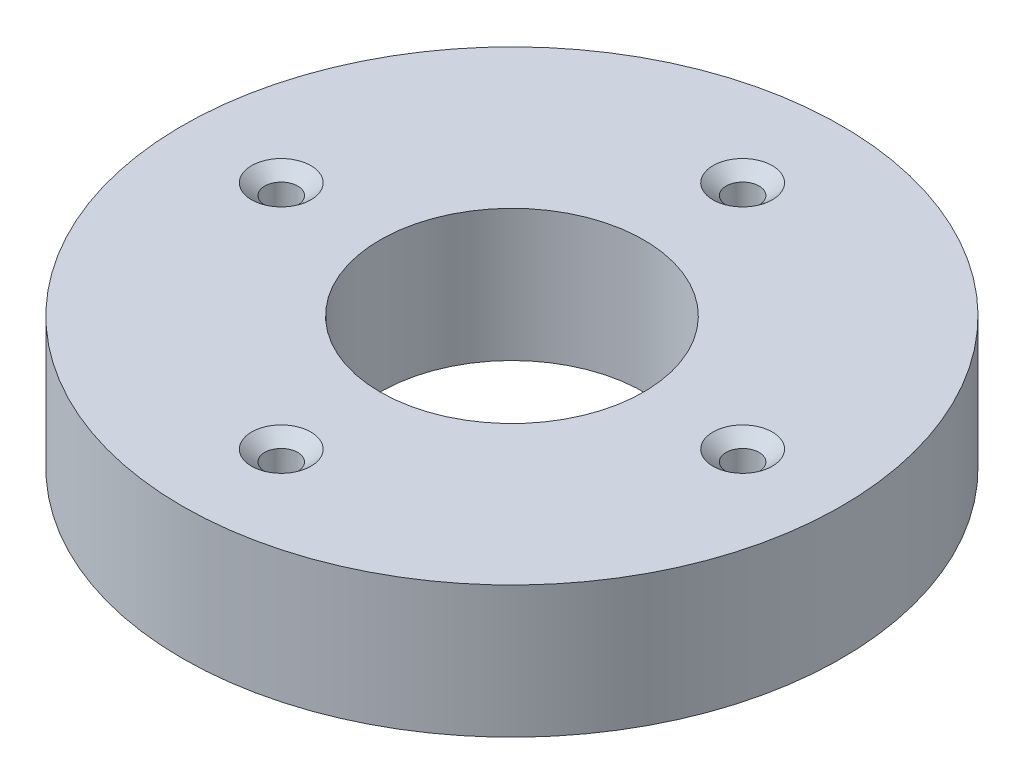
ISO-10303-21;
HEADER;
FILE_DESCRIPTION(('STEP AP214'),'2;1');
FILE_NAME('part.step','',(''),(''),'','','');
FILE_SCHEMA(('AUTOMOTIVE_DESIGN { 1 0 10303 214 1 1 1 1 }'));
ENDSEC;
DATA;
#1=APPLICATION_CONTEXT('core data for automotive mechanical design processes');
#2=APPLICATION_PROTOCOL_DEFINITION('international standard','automotive_design',2000,#1);
#3=PRODUCT_CONTEXT('',#1,'mechanical');
#4=PRODUCT('Part','Part','',(#3));
#5=PRODUCT_RELATED_PRODUCT_CATEGORY('part','',(#4));
#6=PRODUCT_DEFINITION_FORMATION('','',#4);
#7=PRODUCT_DEFINITION_CONTEXT('part definition',#1,'design');
#8=PRODUCT_DEFINITION('design','',#6,#7);
#9=PRODUCT_DEFINITION_SHAPE('','',#8);
#10=(LENGTH_UNIT() NAMED_UNIT(*) SI_UNIT(.MILLI.,.METRE.));
#11=(NAMED_UNIT(*) PLANE_ANGLE_UNIT() SI_UNIT($,.RADIAN.));
#12=(NAMED_UNIT(*) SI_UNIT($,.STERADIAN.) SOLID_ANGLE_UNIT());
#13=UNCERTAINTY_MEASURE_WITH_UNIT(LENGTH_MEASURE(1.E-05),#10,'distance_accuracy_value','');
#14=(GEOMETRIC_REPRESENTATION_CONTEXT(3) GLOBAL_UNCERTAINTY_ASSIGNED_CONTEXT((#13)) GLOBAL_UNIT_ASSIGNED_CONTEXT((#10,
#11,#12)) REPRESENTATION_CONTEXT('',''));
#15=CARTESIAN_POINT('',(0.,0.,0.));
#16=DIRECTION('',(0.,0.,1.));
#17=DIRECTION('',(1.,0.,0.));
#18=AXIS2_PLACEMENT_3D('',#15,#16,#17);
#19=CARTESIAN_POINT('',(0.,6.35,0.));
#20=DIRECTION('',(0.,-1.,0.));
#21=DIRECTION('',(0.,0.,-1.));
#22=AXIS2_PLACEMENT_3D('',#19,#20,#21);
#23=CYLINDRICAL_SURFACE('',#22,15.875);
#24=CARTESIAN_POINT('',(0.,6.35,0.));
#25=DIRECTION('',(0.,1.,0.));
#26=DIRECTION('',(0.,0.,1.));
#27=AXIS2_PLACEMENT_3D('',#24,#25,#26);
#28=CIRCLE('',#27,15.875);
#29=CARTESIAN_POINT('',(0.,6.35,15.875));
#30=VERTEX_POINT('',#29);
#31=EDGE_CURVE('E11',#30,#30,#28,.T.);
#32=ORIENTED_EDGE('',*,*,#31,.F.);
#33=EDGE_LOOP('',(#32));
#34=FACE_BOUND('',#33,.T.);
#35=CARTESIAN_POINT('',(0.,0.,0.));
#36=DIRECTION('',(0.,1.,0.));
#37=DIRECTION('',(0.,0.,1.));
#38=AXIS2_PLACEMENT_3D('',#35,#36,#37);
#39=CIRCLE('',#38,15.875);
#40=CARTESIAN_POINT('',(0.,0.,15.875));
#41=VERTEX_POINT('',#40);
#42=EDGE_CURVE('E43',#41,#41,#39,.T.);
#43=ORIENTED_EDGE('',*,*,#42,.T.);
#44=EDGE_LOOP('',(#43));
#45=FACE_BOUND('',#44,.T.);
#46=ADVANCED_FACE('F40',(#34,#45),#23,.T.);
#47=CARTESIAN_POINT('',(0.,6.35,0.));
#48=DIRECTION('',(0.,1.,0.));
#49=DIRECTION('',(0.,0.,1.));
#50=AXIS2_PLACEMENT_3D('',#47,#48,#49);
#51=PLANE('',#50);
#52=CARTESIAN_POINT('',(-11.1125,6.35,0.));
#53=DIRECTION('',(0.,1.,0.));
#54=DIRECTION('',(0.,0.,1.));
#55=AXIS2_PLACEMENT_3D('',#52,#53,#54);
#56=CIRCLE('',#55,1.42875);
#57=CARTESIAN_POINT('',(-11.1125,6.35,1.42875));
#58=VERTEX_POINT('',#57);
#59=EDGE_CURVE('E70',#58,#58,#56,.T.);
#60=ORIENTED_EDGE('',*,*,#59,.F.);
#61=EDGE_LOOP('',(#60));
#62=FACE_BOUND('',#61,.T.);
#63=CARTESIAN_POINT('',(11.1125,6.35,0.));
#64=DIRECTION('',(0.,1.,0.));
#65=DIRECTION('',(0.,0.,1.));
#66=AXIS2_PLACEMENT_3D('',#63,#64,#65);
#67=CIRCLE('',#66,1.42875);
#68=CARTESIAN_POINT('',(11.1125,6.35,1.42875));
#69=VERTEX_POINT('',#68);
#70=EDGE_CURVE('E63',#69,#69,#67,.T.);
#71=ORIENTED_EDGE('',*,*,#70,.F.);
#72=EDGE_LOOP('',(#71));
#73=FACE_BOUND('',#72,.T.);
#74=CARTESIAN_POINT('',(0.,6.35,11.1125));
#75=DIRECTION('',(0.,1.,0.));
#76=DIRECTION('',(0.,0.,1.));
#77=AXIS2_PLACEMENT_3D('',#74,#75,#76);
#78=CIRCLE('',#77,1.42875);
#79=CARTESIAN_POINT('',(0.,6.35,12.54125));
#80=VERTEX_POINT('',#79);
#81=EDGE_CURVE('E79',#80,#80,#78,.T.);
#82=ORIENTED_EDGE('',*,*,#81,.F.);
#83=EDGE_LOOP('',(#82));
#84=FACE_BOUND('',#83,.T.);
#85=CARTESIAN_POINT('',(0.,6.35,-11.1125));
#86=DIRECTION('',(0.,1.,0.));
#87=DIRECTION('',(0.,0.,1.));
#88=AXIS2_PLACEMENT_3D('',#85,#86,#87);
#89=CIRCLE('',#88,1.42875);
#90=CARTESIAN_POINT('',(0.,6.35,-9.68375));
#91=VERTEX_POINT('',#90);
#92=EDGE_CURVE('E88',#91,#91,#89,.T.);
#93=ORIENTED_EDGE('',*,*,#92,.F.);
#94=EDGE_LOOP('',(#93));
#95=FACE_BOUND('',#94,.T.);
#96=CARTESIAN_POINT('',(0.,6.35,0.));
#97=DIRECTION('',(0.,1.,0.));
#98=DIRECTION('',(0.,0.,1.));
#99=AXIS2_PLACEMENT_3D('',#96,#97,#98);
#100=CIRCLE('',#99,6.35);
#101=CARTESIAN_POINT('',(0.,6.35,6.35));
#102=VERTEX_POINT('',#101);
#103=EDGE_CURVE('E97',#102,#102,#100,.T.);
#104=ORIENTED_EDGE('',*,*,#103,.F.);
#105=EDGE_LOOP('',(#104));
#106=FACE_BOUND('',#105,.T.);
#107=ORIENTED_EDGE('',*,*,#31,.T.);
#108=EDGE_LOOP('',(#107));
#109=FACE_BOUND('',#108,.T.);
#110=ADVANCED_FACE('F106',(#62,#73,#84,#95,#106,#109),#51,.T.);
#111=CARTESIAN_POINT('',(0.,0.,0.));
#112=DIRECTION('',(0.,1.,0.));
#113=DIRECTION('',(0.,0.,1.));
#114=AXIS2_PLACEMENT_3D('',#111,#112,#113);
#115=PLANE('',#114);
#116=CARTESIAN_POINT('',(0.,0.,11.1125));
#117=DIRECTION('',(0.,1.,0.));
#118=DIRECTION('',(0.,0.,1.));
#119=AXIS2_PLACEMENT_3D('',#116,#117,#118);
#120=CIRCLE('',#119,0.793749999999999);
#121=CARTESIAN_POINT('',(0.,0.,11.90625));
#122=VERTEX_POINT('',#121);
#123=EDGE_CURVE('E85',#122,#122,#120,.T.);
#124=ORIENTED_EDGE('',*,*,#123,.T.);
#125=EDGE_LOOP('',(#124));
#126=FACE_BOUND('',#125,.T.);
#127=CARTESIAN_POINT('',(0.,0.,-11.1125));
#128=DIRECTION('',(0.,1.,0.));
#129=DIRECTION('',(0.,0.,1.));
#130=AXIS2_PLACEMENT_3D('',#127,#128,#129);
#131=CIRCLE('',#130,0.793749999999999);
#132=CARTESIAN_POINT('',(0.,0.,-10.31875));
#133=VERTEX_POINT('',#132);
#134=EDGE_CURVE('E94',#133,#133,#131,.T.);
#135=ORIENTED_EDGE('',*,*,#134,.T.);
#136=EDGE_LOOP('',(#135));
#137=FACE_BOUND('',#136,.T.);
#138=CARTESIAN_POINT('',(0.,0.,0.));
#139=DIRECTION('',(0.,1.,0.));
#140=DIRECTION('',(0.,0.,1.));
#141=AXIS2_PLACEMENT_3D('',#138,#139,#140);
#142=CIRCLE('',#141,6.35);
#143=CARTESIAN_POINT('',(0.,0.,6.35));
#144=VERTEX_POINT('',#143);
#145=EDGE_CURVE('E98',#144,#144,#142,.T.);
#146=ORIENTED_EDGE('',*,*,#145,.T.);
#147=EDGE_LOOP('',(#146));
#148=FACE_BOUND('',#147,.T.);
#149=ORIENTED_EDGE('',*,*,#42,.F.);
#150=EDGE_LOOP('',(#149));
#151=FACE_BOUND('',#150,.T.);
#152=ADVANCED_FACE('F109',(#126,#137,#148,#151),#115,.F.);
#153=CARTESIAN_POINT('',(0.,0.,0.));
#154=DIRECTION('',(0.,1.,0.));
#155=DIRECTION('',(0.,0.,1.));
#156=AXIS2_PLACEMENT_3D('',#153,#154,#155);
#157=CYLINDRICAL_SURFACE('',#156,6.35);
#158=ORIENTED_EDGE('',*,*,#145,.F.);
#159=EDGE_LOOP('',(#158));
#160=FACE_BOUND('',#159,.T.);
#161=ORIENTED_EDGE('',*,*,#103,.T.);
#162=EDGE_LOOP('',(#161));
#163=FACE_BOUND('',#162,.T.);
#164=ADVANCED_FACE('F104',(#160,#163),#157,.F.);
#165=CARTESIAN_POINT('',(0.,6.35,-11.1125));
#166=DIRECTION('',(0.,1.,0.));
#167=DIRECTION('',(0.,0.,1.));
#168=AXIS2_PLACEMENT_3D('',#165,#166,#167);
#169=CYLINDRICAL_SURFACE('',#168,0.793749999999999);
#170=ORIENTED_EDGE('',*,*,#134,.F.);
#171=EDGE_LOOP('',(#170));
#172=FACE_BOUND('',#171,.T.);
#173=CARTESIAN_POINT('',(0.,5.81717173420243,-11.1125));
#174=DIRECTION('',(0.,1.,0.));
#175=DIRECTION('',(0.,0.,1.));
#176=AXIS2_PLACEMENT_3D('',#173,#174,#175);
#177=CIRCLE('',#176,0.793749999999999);
#178=CARTESIAN_POINT('',(0.,5.81717173420243,-10.31875));
#179=VERTEX_POINT('',#178);
#180=EDGE_CURVE('E91',#179,#179,#177,.T.);
#181=ORIENTED_EDGE('',*,*,#180,.T.);
#182=EDGE_LOOP('',(#181));
#183=FACE_BOUND('',#182,.T.);
#184=ADVANCED_FACE('F124',(#172,#183),#169,.F.);
#185=CARTESIAN_POINT('',(0.,6.35,-11.1125));
#186=DIRECTION('',(0.,1.,0.));
#187=DIRECTION('',(0.,0.,1.));
#188=AXIS2_PLACEMENT_3D('',#185,#186,#187);
#189=CONICAL_SURFACE('',#188,1.42875,0.872664625997166);
#190=ORIENTED_EDGE('',*,*,#180,.F.);
#191=EDGE_LOOP('',(#190));
#192=FACE_BOUND('',#191,.T.);
#193=ORIENTED_EDGE('',*,*,#92,.T.);
#194=EDGE_LOOP('',(#193));
#195=FACE_BOUND('',#194,.T.);
#196=ADVANCED_FACE('F131',(#192,#195),#189,.F.);
#197=CARTESIAN_POINT('',(0.,6.35,11.1125));
#198=DIRECTION('',(0.,1.,0.));
#199=DIRECTION('',(0.,0.,1.));
#200=AXIS2_PLACEMENT_3D('',#197,#198,#199);
#201=CYLINDRICAL_SURFACE('',#200,0.793749999999999);
#202=ORIENTED_EDGE('',*,*,#123,.F.);
#203=EDGE_LOOP('',(#202));
#204=FACE_BOUND('',#203,.T.);
#205=CARTESIAN_POINT('',(0.,5.81717173420243,11.1125));
#206=DIRECTION('',(0.,1.,0.));
#207=DIRECTION('',(0.,0.,1.));
#208=AXIS2_PLACEMENT_3D('',#205,#206,#207);
#209=CIRCLE('',#208,0.793749999999999);
#210=CARTESIAN_POINT('',(0.,5.81717173420243,11.90625));
#211=VERTEX_POINT('',#210);
#212=EDGE_CURVE('E82',#211,#211,#209,.T.);
#213=ORIENTED_EDGE('',*,*,#212,.T.);
#214=EDGE_LOOP('',(#213));
#215=FACE_BOUND('',#214,.T.);
#216=ADVANCED_FACE('F135',(#204,#215),#201,.F.);
#217=CARTESIAN_POINT('',(0.,6.35,11.1125));
#218=DIRECTION('',(0.,1.,0.));
#219=DIRECTION('',(0.,0.,1.));
#220=AXIS2_PLACEMENT_3D('',#217,#218,#219);
#221=CONICAL_SURFACE('',#220,1.42875,0.872664625997166);
#222=ORIENTED_EDGE('',*,*,#212,.F.);
#223=EDGE_LOOP('',(#222));
#224=FACE_BOUND('',#223,.T.);
#225=ORIENTED_EDGE('',*,*,#81,.T.);
#226=EDGE_LOOP('',(#225));
#227=FACE_BOUND('',#226,.T.);
#228=ADVANCED_FACE('F139',(#224,#227),#221,.F.);
#229=CARTESIAN_POINT('',(11.1125,2.54,0.));
#230=DIRECTION('',(0.,1.,0.));
#231=DIRECTION('',(0.,0.,1.));
#232=AXIS2_PLACEMENT_3D('',#229,#230,#231);
#233=CONICAL_SURFACE('',#232,0.793749999999998,1.02974425867665);
#234=CARTESIAN_POINT('',(11.1125,2.06306688364687,0.));
#235=VERTEX_POINT('',#234);
#236=VERTEX_LOOP('',#235);
#237=FACE_BOUND('',#236,.T.);
#238=CARTESIAN_POINT('',(11.1125,2.54,0.));
#239=DIRECTION('',(0.,1.,0.));
#240=DIRECTION('',(0.,0.,1.));
#241=AXIS2_PLACEMENT_3D('',#238,#239,#240);
#242=CIRCLE('',#241,0.793749999999998);
#243=CARTESIAN_POINT('',(11.1125,2.54,0.793749999999998));
#244=VERTEX_POINT('',#243);
#245=EDGE_CURVE('E76',#244,#244,#242,.T.);
#246=ORIENTED_EDGE('',*,*,#245,.T.);
#247=EDGE_LOOP('',(#246));
#248=FACE_BOUND('',#247,.T.);
#249=ADVANCED_FACE('F143',(#237,#248),#233,.F.);
#250=CARTESIAN_POINT('',(11.1125,6.35,0.));
#251=DIRECTION('',(0.,1.,0.));
#252=DIRECTION('',(0.,0.,1.));
#253=AXIS2_PLACEMENT_3D('',#250,#251,#252);
#254=CYLINDRICAL_SURFACE('',#253,0.793749999999993);
#255=ORIENTED_EDGE('',*,*,#245,.F.);
#256=EDGE_LOOP('',(#255));
#257=FACE_BOUND('',#256,.T.);
#258=CARTESIAN_POINT('',(11.1125,5.81717173420244,0.));
#259=DIRECTION('',(0.,1.,0.));
#260=DIRECTION('',(0.,0.,1.));
#261=AXIS2_PLACEMENT_3D('',#258,#259,#260);
#262=CIRCLE('',#261,0.793749999999989);
#263=CARTESIAN_POINT('',(11.1125,5.81717173420244,0.793749999999989));
#264=VERTEX_POINT('',#263);
#265=EDGE_CURVE('E67',#264,#264,#262,.T.);
#266=ORIENTED_EDGE('',*,*,#265,.T.);
#267=EDGE_LOOP('',(#266));
#268=FACE_BOUND('',#267,.T.);
#269=ADVANCED_FACE('F147',(#257,#268),#254,.F.);
#270=CARTESIAN_POINT('',(11.1125,6.35,0.));
#271=DIRECTION('',(0.,1.,0.));
#272=DIRECTION('',(0.,0.,1.));
#273=AXIS2_PLACEMENT_3D('',#270,#271,#272);
#274=CONICAL_SURFACE('',#273,1.42875,0.87266462599718);
#275=ORIENTED_EDGE('',*,*,#265,.F.);
#276=EDGE_LOOP('',(#275));
#277=FACE_BOUND('',#276,.T.);
#278=ORIENTED_EDGE('',*,*,#70,.T.);
#279=EDGE_LOOP('',(#278));
#280=FACE_BOUND('',#279,.T.);
#281=ADVANCED_FACE('F57',(#277,#280),#274,.F.);
#282=CARTESIAN_POINT('',(-11.1125,2.54,0.));
#283=DIRECTION('',(0.,1.,0.));
#284=DIRECTION('',(0.,0.,1.));
#285=AXIS2_PLACEMENT_3D('',#282,#283,#284);
#286=CONICAL_SURFACE('',#285,0.793749999999998,1.02974425867665);
#287=CARTESIAN_POINT('',(-11.1125,2.06306688364687,0.));
#288=VERTEX_POINT('',#287);
#289=VERTEX_LOOP('',#288);
#290=FACE_BOUND('',#289,.T.);
#291=CARTESIAN_POINT('',(-11.1125,2.54,0.));
#292=DIRECTION('',(0.,1.,0.));
#293=DIRECTION('',(0.,0.,1.));
#294=AXIS2_PLACEMENT_3D('',#291,#292,#293);
#295=CIRCLE('',#294,0.793749999999998);
#296=CARTESIAN_POINT('',(-11.1125,2.54,0.793749999999998));
#297=VERTEX_POINT('',#296);
#298=EDGE_CURVE('E61',#297,#297,#295,.T.);
#299=ORIENTED_EDGE('',*,*,#298,.T.);
#300=EDGE_LOOP('',(#299));
#301=FACE_BOUND('',#300,.T.);
#302=ADVANCED_FACE('F53',(#290,#301),#286,.F.);
#303=CARTESIAN_POINT('',(-11.1125,6.35,0.));
#304=DIRECTION('',(0.,1.,0.));
#305=DIRECTION('',(0.,0.,1.));
#306=AXIS2_PLACEMENT_3D('',#303,#304,#305);
#307=CYLINDRICAL_SURFACE('',#306,0.793749999999993);
#308=ORIENTED_EDGE('',*,*,#298,.F.);
#309=EDGE_LOOP('',(#308));
#310=FACE_BOUND('',#309,.T.);
#311=CARTESIAN_POINT('',(-11.1125,5.81717173420244,0.));
#312=DIRECTION('',(0.,1.,0.));
#313=DIRECTION('',(0.,0.,1.));
#314=AXIS2_PLACEMENT_3D('',#311,#312,#313);
#315=CIRCLE('',#314,0.793749999999989);
#316=CARTESIAN_POINT('',(-11.1125,5.81717173420244,0.793749999999989));
#317=VERTEX_POINT('',#316);
#318=EDGE_CURVE('E64',#317,#317,#315,.T.);
#319=ORIENTED_EDGE('',*,*,#318,.T.);
#320=EDGE_LOOP('',(#319));
#321=FACE_BOUND('',#320,.T.);
#322=ADVANCED_FACE('F56',(#310,#321),#307,.F.);
#323=CARTESIAN_POINT('',(-11.1125,6.35,0.));
#324=DIRECTION('',(0.,1.,0.));
#325=DIRECTION('',(0.,0.,1.));
#326=AXIS2_PLACEMENT_3D('',#323,#324,#325);
#327=CONICAL_SURFACE('',#326,1.42875,0.87266462599718);
#328=ORIENTED_EDGE('',*,*,#318,.F.);
#329=EDGE_LOOP('',(#328));
#330=FACE_BOUND('',#329,.T.);
#331=ORIENTED_EDGE('',*,*,#59,.T.);
#332=EDGE_LOOP('',(#331));
#333=FACE_BOUND('',#332,.T.);
#334=ADVANCED_FACE('F156',(#330,#333),#327,.F.);
#335=CLOSED_SHELL('',(#46,#110,#152,#164,#184,#196,#216,#228,#249,#269,#281,#302,#322,#334));
#336=MANIFOLD_SOLID_BREP('B2',#335);
#337=ADVANCED_BREP_SHAPE_REPRESENTATION('',(#18,#336),#14);
#338=SHAPE_DEFINITION_REPRESENTATION(#9,#337);
ENDSEC;
END-ISO-10303-21;
